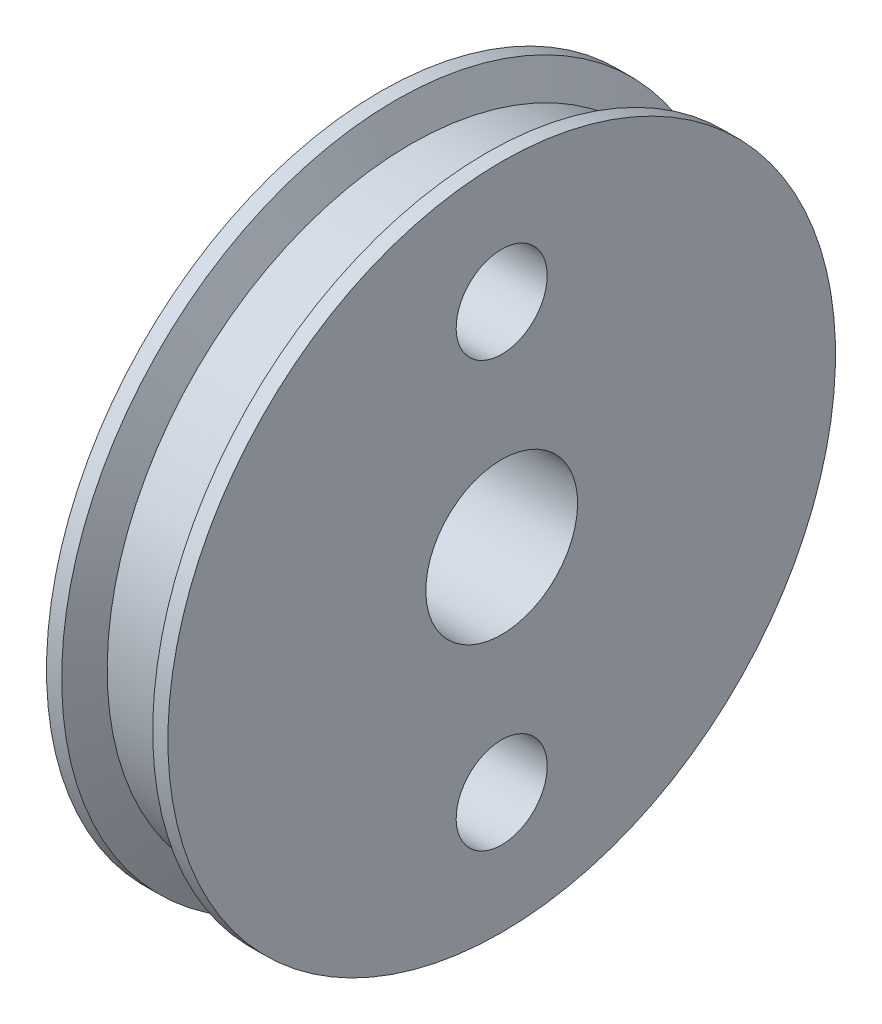
ISO-10303-21;
HEADER;
FILE_DESCRIPTION(('STEP AP214'),'2;1');
FILE_NAME('part.step','',(''),(''),'','','');
FILE_SCHEMA(('AUTOMOTIVE_DESIGN { 1 0 10303 214 1 1 1 1 }'));
ENDSEC;
DATA;
#1=APPLICATION_CONTEXT('core data for automotive mechanical design processes');
#2=APPLICATION_PROTOCOL_DEFINITION('international standard','automotive_design',2000,#1);
#3=PRODUCT_CONTEXT('',#1,'mechanical');
#4=PRODUCT('Part','Part','',(#3));
#5=PRODUCT_RELATED_PRODUCT_CATEGORY('part','',(#4));
#6=PRODUCT_DEFINITION_FORMATION('','',#4);
#7=PRODUCT_DEFINITION_CONTEXT('part definition',#1,'design');
#8=PRODUCT_DEFINITION('design','',#6,#7);
#9=PRODUCT_DEFINITION_SHAPE('','',#8);
#10=(LENGTH_UNIT() NAMED_UNIT(*) SI_UNIT(.MILLI.,.METRE.));
#11=(NAMED_UNIT(*) PLANE_ANGLE_UNIT() SI_UNIT($,.RADIAN.));
#12=(NAMED_UNIT(*) SI_UNIT($,.STERADIAN.) SOLID_ANGLE_UNIT());
#13=UNCERTAINTY_MEASURE_WITH_UNIT(LENGTH_MEASURE(1.E-05),#10,'distance_accuracy_value','');
#14=(GEOMETRIC_REPRESENTATION_CONTEXT(3) GLOBAL_UNCERTAINTY_ASSIGNED_CONTEXT((#13)) GLOBAL_UNIT_ASSIGNED_CONTEXT((#10,
#11,#12)) REPRESENTATION_CONTEXT('',''));
#15=CARTESIAN_POINT('',(0.,0.,0.));
#16=DIRECTION('',(0.,0.,1.));
#17=DIRECTION('',(1.,0.,0.));
#18=AXIS2_PLACEMENT_3D('',#15,#16,#17);
#19=CARTESIAN_POINT('',(0.,0.,0.));
#20=DIRECTION('',(-1.,0.,0.));
#21=DIRECTION('',(0.,-1.,0.));
#22=AXIS2_PLACEMENT_3D('',#19,#20,#21);
#23=PLANE('',#22);
#24=CARTESIAN_POINT('',(0.,-7.,0.));
#25=DIRECTION('',(-1.,0.,0.));
#26=DIRECTION('',(0.,-1.,0.));
#27=AXIS2_PLACEMENT_3D('',#24,#25,#26);
#28=CIRCLE('',#27,1.5);
#29=CARTESIAN_POINT('',(0.,-8.5,0.));
#30=VERTEX_POINT('',#29);
#31=EDGE_CURVE('E56',#30,#30,#28,.T.);
#32=ORIENTED_EDGE('',*,*,#31,.F.);
#33=EDGE_LOOP('',(#32));
#34=FACE_BOUND('',#33,.T.);
#35=CARTESIAN_POINT('',(0.,7.,0.));
#36=DIRECTION('',(-1.,0.,0.));
#37=DIRECTION('',(0.,-1.,0.));
#38=AXIS2_PLACEMENT_3D('',#35,#36,#37);
#39=CIRCLE('',#38,1.5);
#40=CARTESIAN_POINT('',(0.,5.5,0.));
#41=VERTEX_POINT('',#40);
#42=EDGE_CURVE('E59',#41,#41,#39,.T.);
#43=ORIENTED_EDGE('',*,*,#42,.F.);
#44=EDGE_LOOP('',(#43));
#45=FACE_BOUND('',#44,.T.);
#46=CARTESIAN_POINT('',(0.,0.,0.));
#47=DIRECTION('',(-1.,0.,0.));
#48=DIRECTION('',(0.,-1.,0.));
#49=AXIS2_PLACEMENT_3D('',#46,#47,#48);
#50=CIRCLE('',#49,2.5);
#51=CARTESIAN_POINT('',(0.,-2.5,0.));
#52=VERTEX_POINT('',#51);
#53=EDGE_CURVE('E62',#52,#52,#50,.T.);
#54=ORIENTED_EDGE('',*,*,#53,.F.);
#55=EDGE_LOOP('',(#54));
#56=FACE_BOUND('',#55,.T.);
#57=CARTESIAN_POINT('',(0.,0.,0.));
#58=DIRECTION('',(1.,0.,0.));
#59=DIRECTION('',(0.,1.,0.));
#60=AXIS2_PLACEMENT_3D('',#57,#58,#59);
#61=CIRCLE('',#60,11.);
#62=CARTESIAN_POINT('',(0.,11.,0.));
#63=VERTEX_POINT('',#62);
#64=EDGE_CURVE('E10',#63,#63,#61,.T.);
#65=ORIENTED_EDGE('',*,*,#64,.F.);
#66=EDGE_LOOP('',(#65));
#67=FACE_BOUND('',#66,.T.);
#68=ADVANCED_FACE('F31',(#34,#45,#56,#67),#23,.T.);
#69=CARTESIAN_POINT('',(4.,0.,0.));
#70=DIRECTION('',(1.,0.,0.));
#71=DIRECTION('',(0.,1.,0.));
#72=AXIS2_PLACEMENT_3D('',#69,#70,#71);
#73=CYLINDRICAL_SURFACE('',#72,11.);
#74=ORIENTED_EDGE('',*,*,#64,.T.);
#75=EDGE_LOOP('',(#74));
#76=FACE_BOUND('',#75,.T.);
#77=CARTESIAN_POINT('',(0.499999999999995,0.,0.));
#78=DIRECTION('',(1.,0.,0.));
#79=DIRECTION('',(0.,1.,0.));
#80=AXIS2_PLACEMENT_3D('',#77,#78,#79);
#81=CIRCLE('',#80,11.);
#82=CARTESIAN_POINT('',(0.5,11.,0.));
#83=VERTEX_POINT('',#82);
#84=EDGE_CURVE('E37',#83,#83,#81,.T.);
#85=ORIENTED_EDGE('',*,*,#84,.F.);
#86=EDGE_LOOP('',(#85));
#87=FACE_BOUND('',#86,.T.);
#88=ADVANCED_FACE('F99',(#76,#87),#73,.T.);
#89=CARTESIAN_POINT('',(0.999999999999996,0.,0.));
#90=DIRECTION('',(-1.,0.,0.));
#91=DIRECTION('',(0.,-1.,0.));
#92=AXIS2_PLACEMENT_3D('',#89,#90,#91);
#93=CONICAL_SURFACE('',#92,10.,1.10714871779409);
#94=ORIENTED_EDGE('',*,*,#84,.T.);
#95=EDGE_LOOP('',(#94));
#96=FACE_BOUND('',#95,.T.);
#97=CARTESIAN_POINT('',(0.999999999999996,0.,0.));
#98=DIRECTION('',(1.,0.,0.));
#99=DIRECTION('',(0.,1.,0.));
#100=AXIS2_PLACEMENT_3D('',#97,#98,#99);
#101=CIRCLE('',#100,10.);
#102=CARTESIAN_POINT('',(1.,10.,0.));
#103=VERTEX_POINT('',#102);
#104=EDGE_CURVE('E41',#103,#103,#101,.T.);
#105=ORIENTED_EDGE('',*,*,#104,.F.);
#106=EDGE_LOOP('',(#105));
#107=FACE_BOUND('',#106,.T.);
#108=ADVANCED_FACE('F104',(#96,#107),#93,.T.);
#109=CARTESIAN_POINT('',(4.,0.,0.));
#110=DIRECTION('',(1.,0.,0.));
#111=DIRECTION('',(0.,1.,0.));
#112=AXIS2_PLACEMENT_3D('',#109,#110,#111);
#113=CYLINDRICAL_SURFACE('',#112,10.);
#114=ORIENTED_EDGE('',*,*,#104,.T.);
#115=EDGE_LOOP('',(#114));
#116=FACE_BOUND('',#115,.T.);
#117=CARTESIAN_POINT('',(3.,0.,0.));
#118=DIRECTION('',(1.,0.,0.));
#119=DIRECTION('',(0.,1.,0.));
#120=AXIS2_PLACEMENT_3D('',#117,#118,#119);
#121=CIRCLE('',#120,10.);
#122=CARTESIAN_POINT('',(3.,10.,0.));
#123=VERTEX_POINT('',#122);
#124=EDGE_CURVE('E45',#123,#123,#121,.T.);
#125=ORIENTED_EDGE('',*,*,#124,.F.);
#126=EDGE_LOOP('',(#125));
#127=FACE_BOUND('',#126,.T.);
#128=ADVANCED_FACE('F95',(#116,#127),#113,.T.);
#129=CARTESIAN_POINT('',(3.5,0.,0.));
#130=DIRECTION('',(1.,0.,0.));
#131=DIRECTION('',(0.,1.,0.));
#132=AXIS2_PLACEMENT_3D('',#129,#130,#131);
#133=CONICAL_SURFACE('',#132,11.,1.10714871779409);
#134=ORIENTED_EDGE('',*,*,#124,.T.);
#135=EDGE_LOOP('',(#134));
#136=FACE_BOUND('',#135,.T.);
#137=CARTESIAN_POINT('',(3.5,0.,0.));
#138=DIRECTION('',(1.,0.,0.));
#139=DIRECTION('',(0.,1.,0.));
#140=AXIS2_PLACEMENT_3D('',#137,#138,#139);
#141=CIRCLE('',#140,11.);
#142=CARTESIAN_POINT('',(3.5,11.,0.));
#143=VERTEX_POINT('',#142);
#144=EDGE_CURVE('E50',#143,#143,#141,.T.);
#145=ORIENTED_EDGE('',*,*,#144,.F.);
#146=EDGE_LOOP('',(#145));
#147=FACE_BOUND('',#146,.T.);
#148=ADVANCED_FACE('F89',(#136,#147),#133,.T.);
#149=CARTESIAN_POINT('',(4.,0.,0.));
#150=DIRECTION('',(1.,0.,0.));
#151=DIRECTION('',(0.,1.,0.));
#152=AXIS2_PLACEMENT_3D('',#149,#150,#151);
#153=CYLINDRICAL_SURFACE('',#152,11.);
#154=ORIENTED_EDGE('',*,*,#144,.T.);
#155=EDGE_LOOP('',(#154));
#156=FACE_BOUND('',#155,.T.);
#157=CARTESIAN_POINT('',(4.,0.,0.));
#158=DIRECTION('',(1.,0.,0.));
#159=DIRECTION('',(0.,1.,0.));
#160=AXIS2_PLACEMENT_3D('',#157,#158,#159);
#161=CIRCLE('',#160,11.);
#162=CARTESIAN_POINT('',(4.,11.,0.));
#163=VERTEX_POINT('',#162);
#164=EDGE_CURVE('E53',#163,#163,#161,.T.);
#165=ORIENTED_EDGE('',*,*,#164,.F.);
#166=EDGE_LOOP('',(#165));
#167=FACE_BOUND('',#166,.T.);
#168=ADVANCED_FACE('F81',(#156,#167),#153,.T.);
#169=CARTESIAN_POINT('',(4.,11.,0.));
#170=DIRECTION('',(1.,0.,0.));
#171=DIRECTION('',(0.,1.,0.));
#172=AXIS2_PLACEMENT_3D('',#169,#170,#171);
#173=PLANE('',#172);
#174=CARTESIAN_POINT('',(4.,-7.,0.));
#175=DIRECTION('',(1.,0.,0.));
#176=DIRECTION('',(0.,1.,0.));
#177=AXIS2_PLACEMENT_3D('',#174,#175,#176);
#178=CIRCLE('',#177,1.5);
#179=CARTESIAN_POINT('',(4.,-5.5,0.));
#180=VERTEX_POINT('',#179);
#181=EDGE_CURVE('E69',#180,#180,#178,.T.);
#182=ORIENTED_EDGE('',*,*,#181,.F.);
#183=EDGE_LOOP('',(#182));
#184=FACE_BOUND('',#183,.T.);
#185=CARTESIAN_POINT('',(4.,7.,0.));
#186=DIRECTION('',(1.,0.,0.));
#187=DIRECTION('',(0.,1.,0.));
#188=AXIS2_PLACEMENT_3D('',#185,#186,#187);
#189=CIRCLE('',#188,1.5);
#190=CARTESIAN_POINT('',(4.,8.5,0.));
#191=VERTEX_POINT('',#190);
#192=EDGE_CURVE('E68',#191,#191,#189,.T.);
#193=ORIENTED_EDGE('',*,*,#192,.F.);
#194=EDGE_LOOP('',(#193));
#195=FACE_BOUND('',#194,.T.);
#196=CARTESIAN_POINT('',(4.,0.,0.));
#197=DIRECTION('',(1.,0.,0.));
#198=DIRECTION('',(0.,1.,0.));
#199=AXIS2_PLACEMENT_3D('',#196,#197,#198);
#200=CIRCLE('',#199,2.5);
#201=CARTESIAN_POINT('',(4.,2.5,0.));
#202=VERTEX_POINT('',#201);
#203=EDGE_CURVE('E65',#202,#202,#200,.T.);
#204=ORIENTED_EDGE('',*,*,#203,.F.);
#205=EDGE_LOOP('',(#204));
#206=FACE_BOUND('',#205,.T.);
#207=ORIENTED_EDGE('',*,*,#164,.T.);
#208=EDGE_LOOP('',(#207));
#209=FACE_BOUND('',#208,.T.);
#210=ADVANCED_FACE('F77',(#184,#195,#206,#209),#173,.T.);
#211=CARTESIAN_POINT('',(-6.,0.,0.));
#212=DIRECTION('',(1.,0.,0.));
#213=DIRECTION('',(0.,1.,0.));
#214=AXIS2_PLACEMENT_3D('',#211,#212,#213);
#215=CYLINDRICAL_SURFACE('',#214,2.5);
#216=ORIENTED_EDGE('',*,*,#53,.T.);
#217=EDGE_LOOP('',(#216));
#218=FACE_BOUND('',#217,.T.);
#219=ORIENTED_EDGE('',*,*,#203,.T.);
#220=EDGE_LOOP('',(#219));
#221=FACE_BOUND('',#220,.T.);
#222=ADVANCED_FACE('F80',(#218,#221),#215,.F.);
#223=CARTESIAN_POINT('',(-6.,7.,0.));
#224=DIRECTION('',(1.,0.,0.));
#225=DIRECTION('',(0.,1.,0.));
#226=AXIS2_PLACEMENT_3D('',#223,#224,#225);
#227=CYLINDRICAL_SURFACE('',#226,1.5);
#228=ORIENTED_EDGE('',*,*,#42,.T.);
#229=EDGE_LOOP('',(#228));
#230=FACE_BOUND('',#229,.T.);
#231=ORIENTED_EDGE('',*,*,#192,.T.);
#232=EDGE_LOOP('',(#231));
#233=FACE_BOUND('',#232,.T.);
#234=ADVANCED_FACE('F75',(#230,#233),#227,.F.);
#235=CARTESIAN_POINT('',(-6.,-7.,0.));
#236=DIRECTION('',(1.,0.,0.));
#237=DIRECTION('',(0.,1.,0.));
#238=AXIS2_PLACEMENT_3D('',#235,#236,#237);
#239=CYLINDRICAL_SURFACE('',#238,1.5);
#240=ORIENTED_EDGE('',*,*,#31,.T.);
#241=EDGE_LOOP('',(#240));
#242=FACE_BOUND('',#241,.T.);
#243=ORIENTED_EDGE('',*,*,#181,.T.);
#244=EDGE_LOOP('',(#243));
#245=FACE_BOUND('',#244,.T.);
#246=ADVANCED_FACE('F118',(#242,#245),#239,.F.);
#247=CLOSED_SHELL('',(#68,#88,#108,#128,#148,#168,#210,#222,#234,#246));
#248=MANIFOLD_SOLID_BREP('B2',#247);
#249=ADVANCED_BREP_SHAPE_REPRESENTATION('',(#18,#248),#14);
#250=SHAPE_DEFINITION_REPRESENTATION(#9,#249);
ENDSEC;
END-ISO-10303-21;
